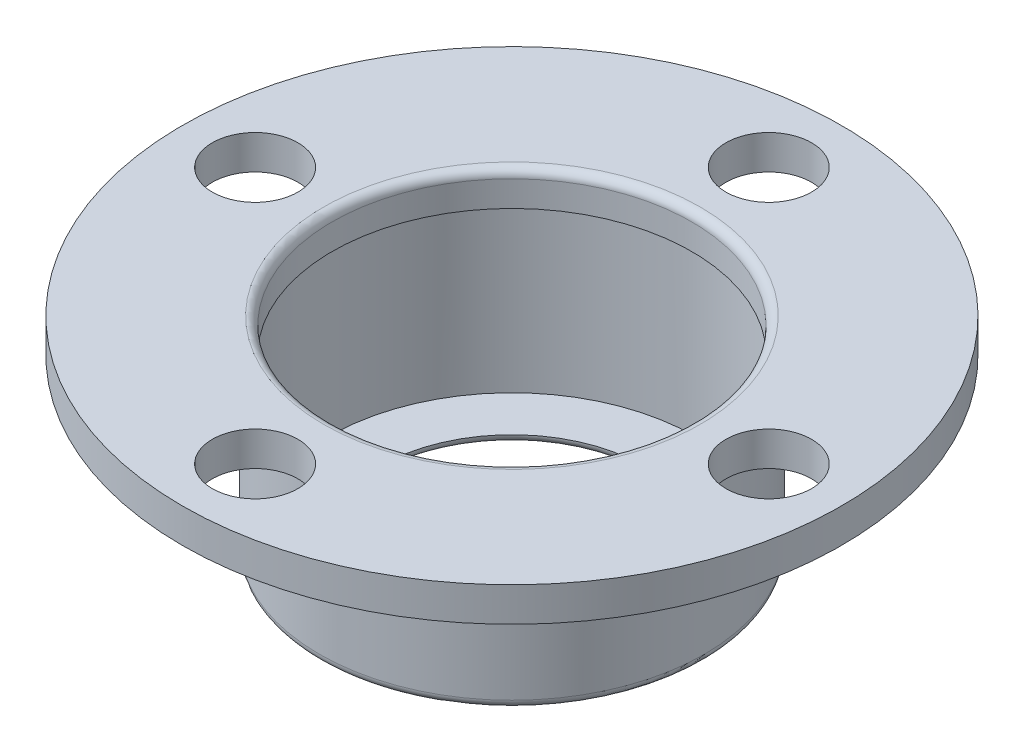
ISO-10303-21;
HEADER;
FILE_DESCRIPTION(('STEP AP214'),'2;1');
FILE_NAME('part.step','',(''),(''),'','','');
FILE_SCHEMA(('AUTOMOTIVE_DESIGN { 1 0 10303 214 1 1 1 1 }'));
ENDSEC;
DATA;
#1=APPLICATION_CONTEXT('core data for automotive mechanical design processes');
#2=APPLICATION_PROTOCOL_DEFINITION('international standard','automotive_design',2000,#1);
#3=PRODUCT_CONTEXT('',#1,'mechanical');
#4=PRODUCT('Part','Part','',(#3));
#5=PRODUCT_RELATED_PRODUCT_CATEGORY('part','',(#4));
#6=PRODUCT_DEFINITION_FORMATION('','',#4);
#7=PRODUCT_DEFINITION_CONTEXT('part definition',#1,'design');
#8=PRODUCT_DEFINITION('design','',#6,#7);
#9=PRODUCT_DEFINITION_SHAPE('','',#8);
#10=(LENGTH_UNIT() NAMED_UNIT(*) SI_UNIT(.MILLI.,.METRE.));
#11=(NAMED_UNIT(*) PLANE_ANGLE_UNIT() SI_UNIT($,.RADIAN.));
#12=(NAMED_UNIT(*) SI_UNIT($,.STERADIAN.) SOLID_ANGLE_UNIT());
#13=UNCERTAINTY_MEASURE_WITH_UNIT(LENGTH_MEASURE(1.E-05),#10,'distance_accuracy_value','');
#14=(GEOMETRIC_REPRESENTATION_CONTEXT(3) GLOBAL_UNCERTAINTY_ASSIGNED_CONTEXT((#13)) GLOBAL_UNIT_ASSIGNED_CONTEXT((#10,
#11,#12)) REPRESENTATION_CONTEXT('',''));
#15=CARTESIAN_POINT('',(0.,0.,0.));
#16=DIRECTION('',(0.,0.,1.));
#17=DIRECTION('',(1.,0.,0.));
#18=AXIS2_PLACEMENT_3D('',#15,#16,#17);
#19=CARTESIAN_POINT('',(0.,4.,0.));
#20=DIRECTION('',(0.,1.,0.));
#21=DIRECTION('',(0.,0.,1.));
#22=AXIS2_PLACEMENT_3D('',#19,#20,#21);
#23=PLANE('',#22);
#24=CARTESIAN_POINT('',(0.,4.,0.));
#25=DIRECTION('',(0.,1.,0.));
#26=DIRECTION('',(0.,0.,1.));
#27=AXIS2_PLACEMENT_3D('',#24,#25,#26);
#28=CIRCLE('',#27,22.);
#29=CARTESIAN_POINT('',(0.,4.,22.));
#30=VERTEX_POINT('',#29);
#31=EDGE_CURVE('E10',#30,#30,#28,.F.);
#32=ORIENTED_EDGE('',*,*,#31,.T.);
#33=EDGE_LOOP('',(#32));
#34=FACE_BOUND('',#33,.T.);
#35=CARTESIAN_POINT('',(30.,4.,2.05814939933146E-13));
#36=DIRECTION('',(0.,1.,0.));
#37=DIRECTION('',(0.,0.,1.));
#38=AXIS2_PLACEMENT_3D('',#35,#36,#37);
#39=CIRCLE('',#38,5.);
#40=CARTESIAN_POINT('',(30.,4.,5.00000000000021));
#41=VERTEX_POINT('',#40);
#42=EDGE_CURVE('E79',#41,#41,#39,.T.);
#43=ORIENTED_EDGE('',*,*,#42,.F.);
#44=EDGE_LOOP('',(#43));
#45=FACE_BOUND('',#44,.T.);
#46=CARTESIAN_POINT('',(-30.,4.,0.));
#47=DIRECTION('',(0.,1.,0.));
#48=DIRECTION('',(0.,0.,1.));
#49=AXIS2_PLACEMENT_3D('',#46,#47,#48);
#50=CIRCLE('',#49,5.);
#51=CARTESIAN_POINT('',(-30.,4.,5.));
#52=VERTEX_POINT('',#51);
#53=EDGE_CURVE('E62',#52,#52,#50,.T.);
#54=ORIENTED_EDGE('',*,*,#53,.F.);
#55=EDGE_LOOP('',(#54));
#56=FACE_BOUND('',#55,.T.);
#57=CARTESIAN_POINT('',(0.,4.,0.));
#58=DIRECTION('',(0.,1.,0.));
#59=DIRECTION('',(0.,0.,1.));
#60=AXIS2_PLACEMENT_3D('',#57,#58,#59);
#61=CIRCLE('',#60,38.5);
#62=CARTESIAN_POINT('',(0.,4.,38.5));
#63=VERTEX_POINT('',#62);
#64=EDGE_CURVE('E58',#63,#63,#61,.T.);
#65=ORIENTED_EDGE('',*,*,#64,.T.);
#66=EDGE_LOOP('',(#65));
#67=FACE_BOUND('',#66,.T.);
#68=CARTESIAN_POINT('',(1.01070499767852E-13,4.,-30.));
#69=DIRECTION('',(0.,1.,0.));
#70=DIRECTION('',(0.,0.,1.));
#71=AXIS2_PLACEMENT_3D('',#68,#69,#70);
#72=CIRCLE('',#71,5.);
#73=CARTESIAN_POINT('',(1.01070499767852E-13,4.,-25.));
#74=VERTEX_POINT('',#73);
#75=EDGE_CURVE('E73',#74,#74,#72,.T.);
#76=ORIENTED_EDGE('',*,*,#75,.F.);
#77=EDGE_LOOP('',(#76));
#78=FACE_BOUND('',#77,.T.);
#79=CARTESIAN_POINT('',(-3.1055938009844E-13,4.,30.));
#80=DIRECTION('',(0.,1.,0.));
#81=DIRECTION('',(0.,0.,1.));
#82=AXIS2_PLACEMENT_3D('',#79,#80,#81);
#83=CIRCLE('',#82,5.);
#84=CARTESIAN_POINT('',(-3.1055938009844E-13,4.,35.));
#85=VERTEX_POINT('',#84);
#86=EDGE_CURVE('E85',#85,#85,#83,.T.);
#87=ORIENTED_EDGE('',*,*,#86,.F.);
#88=EDGE_LOOP('',(#87));
#89=FACE_BOUND('',#88,.T.);
#90=ADVANCED_FACE('F32',(#34,#45,#56,#67,#78,#89),#23,.T.);
#91=CARTESIAN_POINT('',(0.,0.,0.));
#92=DIRECTION('',(0.,1.,0.));
#93=DIRECTION('',(0.,0.,1.));
#94=AXIS2_PLACEMENT_3D('',#91,#92,#93);
#95=PLANE('',#94);
#96=CARTESIAN_POINT('',(0.,0.,0.));
#97=DIRECTION('',(0.,1.,0.));
#98=DIRECTION('',(0.,0.,1.));
#99=AXIS2_PLACEMENT_3D('',#96,#97,#98);
#100=CIRCLE('',#99,22.5);
#101=CARTESIAN_POINT('',(0.,0.,22.5));
#102=VERTEX_POINT('',#101);
#103=EDGE_CURVE('E55',#102,#102,#100,.F.);
#104=ORIENTED_EDGE('',*,*,#103,.F.);
#105=EDGE_LOOP('',(#104));
#106=FACE_BOUND('',#105,.T.);
#107=CARTESIAN_POINT('',(0.,0.,0.));
#108=DIRECTION('',(0.,1.,0.));
#109=DIRECTION('',(0.,0.,1.));
#110=AXIS2_PLACEMENT_3D('',#107,#108,#109);
#111=CIRCLE('',#110,38.5);
#112=CARTESIAN_POINT('',(0.,0.,38.5));
#113=VERTEX_POINT('',#112);
#114=EDGE_CURVE('E59',#113,#113,#111,.T.);
#115=ORIENTED_EDGE('',*,*,#114,.F.);
#116=EDGE_LOOP('',(#115));
#117=FACE_BOUND('',#116,.T.);
#118=CARTESIAN_POINT('',(-30.,0.,0.));
#119=DIRECTION('',(0.,1.,0.));
#120=DIRECTION('',(0.,0.,1.));
#121=AXIS2_PLACEMENT_3D('',#118,#119,#120);
#122=CIRCLE('',#121,5.);
#123=CARTESIAN_POINT('',(-30.,0.,5.));
#124=VERTEX_POINT('',#123);
#125=EDGE_CURVE('E70',#124,#124,#122,.T.);
#126=ORIENTED_EDGE('',*,*,#125,.T.);
#127=EDGE_LOOP('',(#126));
#128=FACE_BOUND('',#127,.T.);
#129=CARTESIAN_POINT('',(1.01070499767852E-13,0.,-30.));
#130=DIRECTION('',(0.,1.,0.));
#131=DIRECTION('',(0.,0.,1.));
#132=AXIS2_PLACEMENT_3D('',#129,#130,#131);
#133=CIRCLE('',#132,5.);
#134=CARTESIAN_POINT('',(1.01070499767852E-13,0.,-25.));
#135=VERTEX_POINT('',#134);
#136=EDGE_CURVE('E76',#135,#135,#133,.T.);
#137=ORIENTED_EDGE('',*,*,#136,.T.);
#138=EDGE_LOOP('',(#137));
#139=FACE_BOUND('',#138,.T.);
#140=CARTESIAN_POINT('',(30.,0.,2.05814939933146E-13));
#141=DIRECTION('',(0.,1.,0.));
#142=DIRECTION('',(0.,0.,1.));
#143=AXIS2_PLACEMENT_3D('',#140,#141,#142);
#144=CIRCLE('',#143,5.);
#145=CARTESIAN_POINT('',(30.,0.,5.00000000000021));
#146=VERTEX_POINT('',#145);
#147=EDGE_CURVE('E82',#146,#146,#144,.T.);
#148=ORIENTED_EDGE('',*,*,#147,.T.);
#149=EDGE_LOOP('',(#148));
#150=FACE_BOUND('',#149,.T.);
#151=CARTESIAN_POINT('',(-3.1055938009844E-13,0.,30.));
#152=DIRECTION('',(0.,1.,0.));
#153=DIRECTION('',(0.,0.,1.));
#154=AXIS2_PLACEMENT_3D('',#151,#152,#153);
#155=CIRCLE('',#154,5.);
#156=CARTESIAN_POINT('',(-3.1055938009844E-13,0.,35.));
#157=VERTEX_POINT('',#156);
#158=EDGE_CURVE('E68',#157,#157,#155,.T.);
#159=ORIENTED_EDGE('',*,*,#158,.T.);
#160=EDGE_LOOP('',(#159));
#161=FACE_BOUND('',#160,.T.);
#162=ADVANCED_FACE('F168',(#106,#117,#128,#139,#150,#161),#95,.F.);
#163=CARTESIAN_POINT('',(0.,4.,0.));
#164=DIRECTION('',(0.,-1.,0.));
#165=DIRECTION('',(0.,0.,-1.));
#166=AXIS2_PLACEMENT_3D('',#163,#164,#165);
#167=CYLINDRICAL_SURFACE('',#166,38.5);
#168=ORIENTED_EDGE('',*,*,#64,.F.);
#169=EDGE_LOOP('',(#168));
#170=FACE_BOUND('',#169,.T.);
#171=ORIENTED_EDGE('',*,*,#114,.T.);
#172=EDGE_LOOP('',(#171));
#173=FACE_BOUND('',#172,.T.);
#174=ADVANCED_FACE('F173',(#170,#173),#167,.T.);
#175=CARTESIAN_POINT('',(0.,4.,0.));
#176=DIRECTION('',(0.,-1.,0.));
#177=DIRECTION('',(0.,0.,-1.));
#178=AXIS2_PLACEMENT_3D('',#175,#176,#177);
#179=CYLINDRICAL_SURFACE('',#178,21.);
#180=CARTESIAN_POINT('',(0.,3.,0.));
#181=DIRECTION('',(0.,1.,0.));
#182=DIRECTION('',(0.,0.,1.));
#183=AXIS2_PLACEMENT_3D('',#180,#181,#182);
#184=CIRCLE('',#183,21.);
#185=CARTESIAN_POINT('',(0.,3.,21.));
#186=VERTEX_POINT('',#185);
#187=EDGE_CURVE('E39',#186,#186,#184,.T.);
#188=ORIENTED_EDGE('',*,*,#187,.T.);
#189=EDGE_LOOP('',(#188));
#190=FACE_BOUND('',#189,.T.);
#191=CARTESIAN_POINT('',(0.,0.,0.));
#192=DIRECTION('',(0.,1.,0.));
#193=DIRECTION('',(0.,0.,1.));
#194=AXIS2_PLACEMENT_3D('',#191,#192,#193);
#195=CIRCLE('',#194,21.);
#196=CARTESIAN_POINT('',(0.,0.,21.));
#197=VERTEX_POINT('',#196);
#198=EDGE_CURVE('E65',#197,#197,#195,.T.);
#199=ORIENTED_EDGE('',*,*,#198,.F.);
#200=EDGE_LOOP('',(#199));
#201=FACE_BOUND('',#200,.T.);
#202=ADVANCED_FACE('F178',(#190,#201),#179,.F.);
#203=CARTESIAN_POINT('',(-30.,4.,0.));
#204=DIRECTION('',(0.,-1.,0.));
#205=DIRECTION('',(0.,0.,-1.));
#206=AXIS2_PLACEMENT_3D('',#203,#204,#205);
#207=CYLINDRICAL_SURFACE('',#206,5.);
#208=ORIENTED_EDGE('',*,*,#53,.T.);
#209=EDGE_LOOP('',(#208));
#210=FACE_BOUND('',#209,.T.);
#211=ORIENTED_EDGE('',*,*,#125,.F.);
#212=EDGE_LOOP('',(#211));
#213=FACE_BOUND('',#212,.T.);
#214=ADVANCED_FACE('F221',(#210,#213),#207,.F.);
#215=CARTESIAN_POINT('',(1.01070499767852E-13,4.,-30.));
#216=DIRECTION('',(0.,-1.,0.));
#217=DIRECTION('',(0.,0.,-1.));
#218=AXIS2_PLACEMENT_3D('',#215,#216,#217);
#219=CYLINDRICAL_SURFACE('',#218,5.);
#220=ORIENTED_EDGE('',*,*,#75,.T.);
#221=EDGE_LOOP('',(#220));
#222=FACE_BOUND('',#221,.T.);
#223=ORIENTED_EDGE('',*,*,#136,.F.);
#224=EDGE_LOOP('',(#223));
#225=FACE_BOUND('',#224,.T.);
#226=ADVANCED_FACE('F218',(#222,#225),#219,.F.);
#227=CARTESIAN_POINT('',(30.,4.,2.05814939933146E-13));
#228=DIRECTION('',(0.,-1.,0.));
#229=DIRECTION('',(0.,0.,-1.));
#230=AXIS2_PLACEMENT_3D('',#227,#228,#229);
#231=CYLINDRICAL_SURFACE('',#230,5.);
#232=ORIENTED_EDGE('',*,*,#42,.T.);
#233=EDGE_LOOP('',(#232));
#234=FACE_BOUND('',#233,.T.);
#235=ORIENTED_EDGE('',*,*,#147,.F.);
#236=EDGE_LOOP('',(#235));
#237=FACE_BOUND('',#236,.T.);
#238=ADVANCED_FACE('F211',(#234,#237),#231,.F.);
#239=CARTESIAN_POINT('',(-3.1055938009844E-13,4.,30.));
#240=DIRECTION('',(0.,-1.,0.));
#241=DIRECTION('',(0.,0.,-1.));
#242=AXIS2_PLACEMENT_3D('',#239,#240,#241);
#243=CYLINDRICAL_SURFACE('',#242,5.);
#244=ORIENTED_EDGE('',*,*,#86,.T.);
#245=EDGE_LOOP('',(#244));
#246=FACE_BOUND('',#245,.T.);
#247=ORIENTED_EDGE('',*,*,#158,.F.);
#248=EDGE_LOOP('',(#247));
#249=FACE_BOUND('',#248,.T.);
#250=ADVANCED_FACE('F201',(#246,#249),#243,.F.);
#251=CARTESIAN_POINT('',(0.,-20.,0.));
#252=DIRECTION('',(0.,-1.,0.));
#253=DIRECTION('',(0.,0.,-1.));
#254=AXIS2_PLACEMENT_3D('',#251,#252,#253);
#255=PLANE('',#254);
#256=CARTESIAN_POINT('',(0.,-20.,0.));
#257=DIRECTION('',(0.,-1.,0.));
#258=DIRECTION('',(0.,0.,-1.));
#259=AXIS2_PLACEMENT_3D('',#256,#257,#258);
#260=CIRCLE('',#259,16.5);
#261=CARTESIAN_POINT('',(0.,-20.,-16.5));
#262=VERTEX_POINT('',#261);
#263=EDGE_CURVE('E47',#262,#262,#260,.F.);
#264=ORIENTED_EDGE('',*,*,#263,.T.);
#265=EDGE_LOOP('',(#264));
#266=FACE_BOUND('',#265,.T.);
#267=CARTESIAN_POINT('',(0.,-20.,0.));
#268=DIRECTION('',(0.,-1.,0.));
#269=DIRECTION('',(0.,0.,-1.));
#270=AXIS2_PLACEMENT_3D('',#267,#268,#269);
#271=CIRCLE('',#270,21.5);
#272=CARTESIAN_POINT('',(0.,-20.,-21.5));
#273=VERTEX_POINT('',#272);
#274=EDGE_CURVE('E52',#273,#273,#271,.T.);
#275=ORIENTED_EDGE('',*,*,#274,.T.);
#276=EDGE_LOOP('',(#275));
#277=FACE_BOUND('',#276,.T.);
#278=ADVANCED_FACE('F198',(#266,#277),#255,.T.);
#279=CARTESIAN_POINT('',(0.,-20.,0.));
#280=DIRECTION('',(0.,1.,0.));
#281=DIRECTION('',(0.,0.,1.));
#282=AXIS2_PLACEMENT_3D('',#279,#280,#281);
#283=CYLINDRICAL_SURFACE('',#282,22.5);
#284=CARTESIAN_POINT('',(0.,-19.,0.));
#285=DIRECTION('',(0.,-1.,0.));
#286=DIRECTION('',(0.,0.,-1.));
#287=AXIS2_PLACEMENT_3D('',#284,#285,#286);
#288=CIRCLE('',#287,22.5);
#289=CARTESIAN_POINT('',(0.,-19.,-22.5));
#290=VERTEX_POINT('',#289);
#291=EDGE_CURVE('E43',#290,#290,#288,.F.);
#292=ORIENTED_EDGE('',*,*,#291,.T.);
#293=EDGE_LOOP('',(#292));
#294=FACE_BOUND('',#293,.T.);
#295=ORIENTED_EDGE('',*,*,#103,.T.);
#296=EDGE_LOOP('',(#295));
#297=FACE_BOUND('',#296,.T.);
#298=ADVANCED_FACE('F200',(#294,#297),#283,.T.);
#299=CARTESIAN_POINT('',(0.,0.,0.));
#300=DIRECTION('',(0.,-1.,0.));
#301=DIRECTION('',(0.,0.,-1.));
#302=AXIS2_PLACEMENT_3D('',#299,#300,#301);
#303=PLANE('',#302);
#304=CARTESIAN_POINT('',(0.,0.,0.));
#305=DIRECTION('',(0.,-1.,0.));
#306=DIRECTION('',(0.,0.,-1.));
#307=AXIS2_PLACEMENT_3D('',#304,#305,#306);
#308=CIRCLE('',#307,22.);
#309=CARTESIAN_POINT('',(0.,0.,-22.));
#310=VERTEX_POINT('',#309);
#311=EDGE_CURVE('E92',#310,#310,#308,.F.);
#312=ORIENTED_EDGE('',*,*,#311,.F.);
#313=EDGE_LOOP('',(#312));
#314=FACE_BOUND('',#313,.T.);
#315=ORIENTED_EDGE('',*,*,#198,.T.);
#316=EDGE_LOOP('',(#315));
#317=FACE_BOUND('',#316,.T.);
#318=ADVANCED_FACE('F208',(#314,#317),#303,.T.);
#319=CARTESIAN_POINT('',(0.,3.,0.));
#320=DIRECTION('',(0.,1.,0.));
#321=DIRECTION('',(0.,0.,1.));
#322=AXIS2_PLACEMENT_3D('',#319,#320,#321);
#323=PLANE('',#322);
#324=CARTESIAN_POINT('',(30.,3.,2.05814939933146E-13));
#325=DIRECTION('',(0.,1.,0.));
#326=DIRECTION('',(0.,0.,1.));
#327=AXIS2_PLACEMENT_3D('',#324,#325,#326);
#328=CIRCLE('',#327,6.);
#329=CARTESIAN_POINT('',(30.,3.,6.00000000000021));
#330=VERTEX_POINT('',#329);
#331=EDGE_CURVE('E110',#330,#330,#328,.T.);
#332=ORIENTED_EDGE('',*,*,#331,.T.);
#333=EDGE_LOOP('',(#332));
#334=FACE_BOUND('',#333,.T.);
#335=CARTESIAN_POINT('',(-30.,3.,0.));
#336=DIRECTION('',(0.,1.,0.));
#337=DIRECTION('',(0.,0.,1.));
#338=AXIS2_PLACEMENT_3D('',#335,#336,#337);
#339=CIRCLE('',#338,6.);
#340=CARTESIAN_POINT('',(-30.,3.,6.));
#341=VERTEX_POINT('',#340);
#342=EDGE_CURVE('E96',#341,#341,#339,.T.);
#343=ORIENTED_EDGE('',*,*,#342,.T.);
#344=EDGE_LOOP('',(#343));
#345=FACE_BOUND('',#344,.T.);
#346=CARTESIAN_POINT('',(0.,3.,0.));
#347=DIRECTION('',(0.,1.,0.));
#348=DIRECTION('',(0.,0.,1.));
#349=AXIS2_PLACEMENT_3D('',#346,#347,#348);
#350=CIRCLE('',#349,37.5);
#351=CARTESIAN_POINT('',(0.,3.,37.5));
#352=VERTEX_POINT('',#351);
#353=EDGE_CURVE('E120',#352,#352,#350,.T.);
#354=ORIENTED_EDGE('',*,*,#353,.F.);
#355=EDGE_LOOP('',(#354));
#356=FACE_BOUND('',#355,.T.);
#357=CARTESIAN_POINT('',(0.,3.,0.));
#358=DIRECTION('',(0.,1.,0.));
#359=DIRECTION('',(0.,0.,1.));
#360=AXIS2_PLACEMENT_3D('',#357,#358,#359);
#361=CIRCLE('',#360,22.);
#362=CARTESIAN_POINT('',(0.,3.,22.));
#363=VERTEX_POINT('',#362);
#364=EDGE_CURVE('E95',#363,#363,#361,.T.);
#365=ORIENTED_EDGE('',*,*,#364,.T.);
#366=EDGE_LOOP('',(#365));
#367=FACE_BOUND('',#366,.T.);
#368=CARTESIAN_POINT('',(1.01070499767852E-13,3.,-30.));
#369=DIRECTION('',(0.,1.,0.));
#370=DIRECTION('',(0.,0.,1.));
#371=AXIS2_PLACEMENT_3D('',#368,#369,#370);
#372=CIRCLE('',#371,6.);
#373=CARTESIAN_POINT('',(1.01070499767852E-13,3.,-24.));
#374=VERTEX_POINT('',#373);
#375=EDGE_CURVE('E114',#374,#374,#372,.T.);
#376=ORIENTED_EDGE('',*,*,#375,.T.);
#377=EDGE_LOOP('',(#376));
#378=FACE_BOUND('',#377,.T.);
#379=CARTESIAN_POINT('',(-3.1055938009844E-13,3.,30.));
#380=DIRECTION('',(0.,1.,0.));
#381=DIRECTION('',(0.,0.,1.));
#382=AXIS2_PLACEMENT_3D('',#379,#380,#381);
#383=CIRCLE('',#382,6.);
#384=CARTESIAN_POINT('',(-3.1055938009844E-13,3.,36.));
#385=VERTEX_POINT('',#384);
#386=EDGE_CURVE('E106',#385,#385,#383,.T.);
#387=ORIENTED_EDGE('',*,*,#386,.T.);
#388=EDGE_LOOP('',(#387));
#389=FACE_BOUND('',#388,.T.);
#390=ADVANCED_FACE('F137',(#334,#345,#356,#367,#378,#389),#323,.F.);
#391=CARTESIAN_POINT('',(0.,1.,0.));
#392=DIRECTION('',(0.,1.,0.));
#393=DIRECTION('',(0.,0.,1.));
#394=AXIS2_PLACEMENT_3D('',#391,#392,#393);
#395=PLANE('',#394);
#396=CARTESIAN_POINT('',(0.,1.,0.));
#397=DIRECTION('',(0.,1.,0.));
#398=DIRECTION('',(0.,0.,1.));
#399=AXIS2_PLACEMENT_3D('',#396,#397,#398);
#400=CIRCLE('',#399,21.5);
#401=CARTESIAN_POINT('',(0.,1.,21.5));
#402=VERTEX_POINT('',#401);
#403=EDGE_CURVE('E69',#402,#402,#400,.F.);
#404=ORIENTED_EDGE('',*,*,#403,.T.);
#405=EDGE_LOOP('',(#404));
#406=FACE_BOUND('',#405,.T.);
#407=CARTESIAN_POINT('',(0.,1.,0.));
#408=DIRECTION('',(0.,1.,0.));
#409=DIRECTION('',(0.,0.,1.));
#410=AXIS2_PLACEMENT_3D('',#407,#408,#409);
#411=CIRCLE('',#410,37.5);
#412=CARTESIAN_POINT('',(0.,1.,37.5));
#413=VERTEX_POINT('',#412);
#414=EDGE_CURVE('E121',#413,#413,#411,.T.);
#415=ORIENTED_EDGE('',*,*,#414,.T.);
#416=EDGE_LOOP('',(#415));
#417=FACE_BOUND('',#416,.T.);
#418=CARTESIAN_POINT('',(-30.,1.,0.));
#419=DIRECTION('',(0.,1.,0.));
#420=DIRECTION('',(0.,0.,1.));
#421=AXIS2_PLACEMENT_3D('',#418,#419,#420);
#422=CIRCLE('',#421,6.);
#423=CARTESIAN_POINT('',(-30.,1.,6.));
#424=VERTEX_POINT('',#423);
#425=EDGE_CURVE('E115',#424,#424,#422,.T.);
#426=ORIENTED_EDGE('',*,*,#425,.F.);
#427=EDGE_LOOP('',(#426));
#428=FACE_BOUND('',#427,.T.);
#429=CARTESIAN_POINT('',(1.01070499767852E-13,1.,-30.));
#430=DIRECTION('',(0.,1.,0.));
#431=DIRECTION('',(0.,0.,1.));
#432=AXIS2_PLACEMENT_3D('',#429,#430,#431);
#433=CIRCLE('',#432,6.);
#434=CARTESIAN_POINT('',(1.01070499767852E-13,1.,-24.));
#435=VERTEX_POINT('',#434);
#436=EDGE_CURVE('E111',#435,#435,#433,.T.);
#437=ORIENTED_EDGE('',*,*,#436,.F.);
#438=EDGE_LOOP('',(#437));
#439=FACE_BOUND('',#438,.T.);
#440=CARTESIAN_POINT('',(30.,1.,2.05814939933146E-13));
#441=DIRECTION('',(0.,1.,0.));
#442=DIRECTION('',(0.,0.,1.));
#443=AXIS2_PLACEMENT_3D('',#440,#441,#442);
#444=CIRCLE('',#443,6.);
#445=CARTESIAN_POINT('',(30.,1.,6.00000000000021));
#446=VERTEX_POINT('',#445);
#447=EDGE_CURVE('E107',#446,#446,#444,.T.);
#448=ORIENTED_EDGE('',*,*,#447,.F.);
#449=EDGE_LOOP('',(#448));
#450=FACE_BOUND('',#449,.T.);
#451=CARTESIAN_POINT('',(-3.1055938009844E-13,1.,30.));
#452=DIRECTION('',(0.,1.,0.));
#453=DIRECTION('',(0.,0.,1.));
#454=AXIS2_PLACEMENT_3D('',#451,#452,#453);
#455=CIRCLE('',#454,6.);
#456=CARTESIAN_POINT('',(-3.1055938009844E-13,1.,36.));
#457=VERTEX_POINT('',#456);
#458=EDGE_CURVE('E103',#457,#457,#455,.T.);
#459=ORIENTED_EDGE('',*,*,#458,.F.);
#460=EDGE_LOOP('',(#459));
#461=FACE_BOUND('',#460,.T.);
#462=ADVANCED_FACE('F148',(#406,#417,#428,#439,#450,#461),#395,.T.);
#463=CARTESIAN_POINT('',(0.,4.,0.));
#464=DIRECTION('',(0.,-1.,0.));
#465=DIRECTION('',(0.,0.,-1.));
#466=AXIS2_PLACEMENT_3D('',#463,#464,#465);
#467=CYLINDRICAL_SURFACE('',#466,37.5);
#468=ORIENTED_EDGE('',*,*,#353,.T.);
#469=EDGE_LOOP('',(#468));
#470=FACE_BOUND('',#469,.T.);
#471=ORIENTED_EDGE('',*,*,#414,.F.);
#472=EDGE_LOOP('',(#471));
#473=FACE_BOUND('',#472,.T.);
#474=ADVANCED_FACE('F151',(#470,#473),#467,.F.);
#475=CARTESIAN_POINT('',(0.,4.,0.));
#476=DIRECTION('',(0.,-1.,0.));
#477=DIRECTION('',(0.,0.,-1.));
#478=AXIS2_PLACEMENT_3D('',#475,#476,#477);
#479=CYLINDRICAL_SURFACE('',#478,22.);
#480=ORIENTED_EDGE('',*,*,#364,.F.);
#481=EDGE_LOOP('',(#480));
#482=FACE_BOUND('',#481,.T.);
#483=ORIENTED_EDGE('',*,*,#311,.T.);
#484=EDGE_LOOP('',(#483));
#485=FACE_BOUND('',#484,.T.);
#486=ADVANCED_FACE('F267',(#482,#485),#479,.T.);
#487=CARTESIAN_POINT('',(-30.,4.,0.));
#488=DIRECTION('',(0.,-1.,0.));
#489=DIRECTION('',(0.,0.,-1.));
#490=AXIS2_PLACEMENT_3D('',#487,#488,#489);
#491=CYLINDRICAL_SURFACE('',#490,6.);
#492=ORIENTED_EDGE('',*,*,#342,.F.);
#493=EDGE_LOOP('',(#492));
#494=FACE_BOUND('',#493,.T.);
#495=ORIENTED_EDGE('',*,*,#425,.T.);
#496=EDGE_LOOP('',(#495));
#497=FACE_BOUND('',#496,.T.);
#498=ADVANCED_FACE('F271',(#494,#497),#491,.T.);
#499=CARTESIAN_POINT('',(1.01070499767852E-13,4.,-30.));
#500=DIRECTION('',(0.,-1.,0.));
#501=DIRECTION('',(0.,0.,-1.));
#502=AXIS2_PLACEMENT_3D('',#499,#500,#501);
#503=CYLINDRICAL_SURFACE('',#502,6.);
#504=ORIENTED_EDGE('',*,*,#375,.F.);
#505=EDGE_LOOP('',(#504));
#506=FACE_BOUND('',#505,.T.);
#507=ORIENTED_EDGE('',*,*,#436,.T.);
#508=EDGE_LOOP('',(#507));
#509=FACE_BOUND('',#508,.T.);
#510=ADVANCED_FACE('F144',(#506,#509),#503,.T.);
#511=CARTESIAN_POINT('',(30.,4.,2.05814939933146E-13));
#512=DIRECTION('',(0.,-1.,0.));
#513=DIRECTION('',(0.,0.,-1.));
#514=AXIS2_PLACEMENT_3D('',#511,#512,#513);
#515=CYLINDRICAL_SURFACE('',#514,6.);
#516=ORIENTED_EDGE('',*,*,#331,.F.);
#517=EDGE_LOOP('',(#516));
#518=FACE_BOUND('',#517,.T.);
#519=ORIENTED_EDGE('',*,*,#447,.T.);
#520=EDGE_LOOP('',(#519));
#521=FACE_BOUND('',#520,.T.);
#522=ADVANCED_FACE('F140',(#518,#521),#515,.T.);
#523=CARTESIAN_POINT('',(-3.1055938009844E-13,4.,30.));
#524=DIRECTION('',(0.,-1.,0.));
#525=DIRECTION('',(0.,0.,-1.));
#526=AXIS2_PLACEMENT_3D('',#523,#524,#525);
#527=CYLINDRICAL_SURFACE('',#526,6.);
#528=ORIENTED_EDGE('',*,*,#386,.F.);
#529=EDGE_LOOP('',(#528));
#530=FACE_BOUND('',#529,.T.);
#531=ORIENTED_EDGE('',*,*,#458,.T.);
#532=EDGE_LOOP('',(#531));
#533=FACE_BOUND('',#532,.T.);
#534=ADVANCED_FACE('F143',(#530,#533),#527,.T.);
#535=CARTESIAN_POINT('',(0.,-19.,0.));
#536=DIRECTION('',(0.,-1.,0.));
#537=DIRECTION('',(0.,0.,-1.));
#538=AXIS2_PLACEMENT_3D('',#535,#536,#537);
#539=PLANE('',#538);
#540=CARTESIAN_POINT('',(0.,-19.,0.));
#541=DIRECTION('',(0.,-1.,0.));
#542=DIRECTION('',(0.,0.,-1.));
#543=AXIS2_PLACEMENT_3D('',#540,#541,#542);
#544=CIRCLE('',#543,21.5);
#545=CARTESIAN_POINT('',(0.,-19.,-21.5));
#546=VERTEX_POINT('',#545);
#547=EDGE_CURVE('E100',#546,#546,#544,.T.);
#548=ORIENTED_EDGE('',*,*,#547,.F.);
#549=EDGE_LOOP('',(#548));
#550=FACE_BOUND('',#549,.T.);
#551=CARTESIAN_POINT('',(0.,-19.,0.));
#552=DIRECTION('',(0.,-1.,0.));
#553=DIRECTION('',(0.,0.,-1.));
#554=AXIS2_PLACEMENT_3D('',#551,#552,#553);
#555=CIRCLE('',#554,15.5);
#556=CARTESIAN_POINT('',(0.,-19.,-15.5));
#557=VERTEX_POINT('',#556);
#558=EDGE_CURVE('E97',#557,#557,#555,.T.);
#559=ORIENTED_EDGE('',*,*,#558,.T.);
#560=EDGE_LOOP('',(#559));
#561=FACE_BOUND('',#560,.T.);
#562=ADVANCED_FACE('F157',(#550,#561),#539,.F.);
#563=CARTESIAN_POINT('',(0.,-20.,0.));
#564=DIRECTION('',(0.,1.,0.));
#565=DIRECTION('',(0.,0.,1.));
#566=AXIS2_PLACEMENT_3D('',#563,#564,#565);
#567=CYLINDRICAL_SURFACE('',#566,21.5);
#568=ORIENTED_EDGE('',*,*,#547,.T.);
#569=EDGE_LOOP('',(#568));
#570=FACE_BOUND('',#569,.T.);
#571=ORIENTED_EDGE('',*,*,#403,.F.);
#572=EDGE_LOOP('',(#571));
#573=FACE_BOUND('',#572,.T.);
#574=ADVANCED_FACE('F163',(#570,#573),#567,.F.);
#575=CARTESIAN_POINT('',(0.,-19.,0.));
#576=DIRECTION('',(0.,-1.,0.));
#577=DIRECTION('',(0.,0.,-1.));
#578=AXIS2_PLACEMENT_3D('',#575,#576,#577);
#579=TOROIDAL_SURFACE('',#578,16.5,1.);
#580=ORIENTED_EDGE('',*,*,#263,.F.);
#581=EDGE_LOOP('',(#580));
#582=FACE_BOUND('',#581,.T.);
#583=ORIENTED_EDGE('',*,*,#558,.F.);
#584=EDGE_LOOP('',(#583));
#585=FACE_BOUND('',#584,.T.);
#586=ADVANCED_FACE('F184',(#582,#585),#579,.T.);
#587=CARTESIAN_POINT('',(0.,-19.,0.));
#588=DIRECTION('',(0.,-1.,0.));
#589=DIRECTION('',(0.,0.,-1.));
#590=AXIS2_PLACEMENT_3D('',#587,#588,#589);
#591=TOROIDAL_SURFACE('',#590,21.5,1.);
#592=ORIENTED_EDGE('',*,*,#291,.F.);
#593=EDGE_LOOP('',(#592));
#594=FACE_BOUND('',#593,.T.);
#595=ORIENTED_EDGE('',*,*,#274,.F.);
#596=EDGE_LOOP('',(#595));
#597=FACE_BOUND('',#596,.T.);
#598=ADVANCED_FACE('F186',(#594,#597),#591,.T.);
#599=CARTESIAN_POINT('',(0.,3.,0.));
#600=DIRECTION('',(0.,1.,0.));
#601=DIRECTION('',(0.,0.,1.));
#602=AXIS2_PLACEMENT_3D('',#599,#600,#601);
#603=TOROIDAL_SURFACE('',#602,22.,1.);
#604=ORIENTED_EDGE('',*,*,#31,.F.);
#605=EDGE_LOOP('',(#604));
#606=FACE_BOUND('',#605,.T.);
#607=ORIENTED_EDGE('',*,*,#187,.F.);
#608=EDGE_LOOP('',(#607));
#609=FACE_BOUND('',#608,.T.);
#610=ADVANCED_FACE('F34',(#606,#609),#603,.T.);
#611=CLOSED_SHELL('',(#90,#162,#174,#202,#214,#226,#238,#250,#278,#298,#318,#390,#462,#474,#486,
#498,#510,#522,#534,#562,#574,#586,#598,#610));
#612=MANIFOLD_SOLID_BREP('B2',#611);
#613=ADVANCED_BREP_SHAPE_REPRESENTATION('',(#18,#612),#14);
#614=SHAPE_DEFINITION_REPRESENTATION(#9,#613);
ENDSEC;
END-ISO-10303-21;
